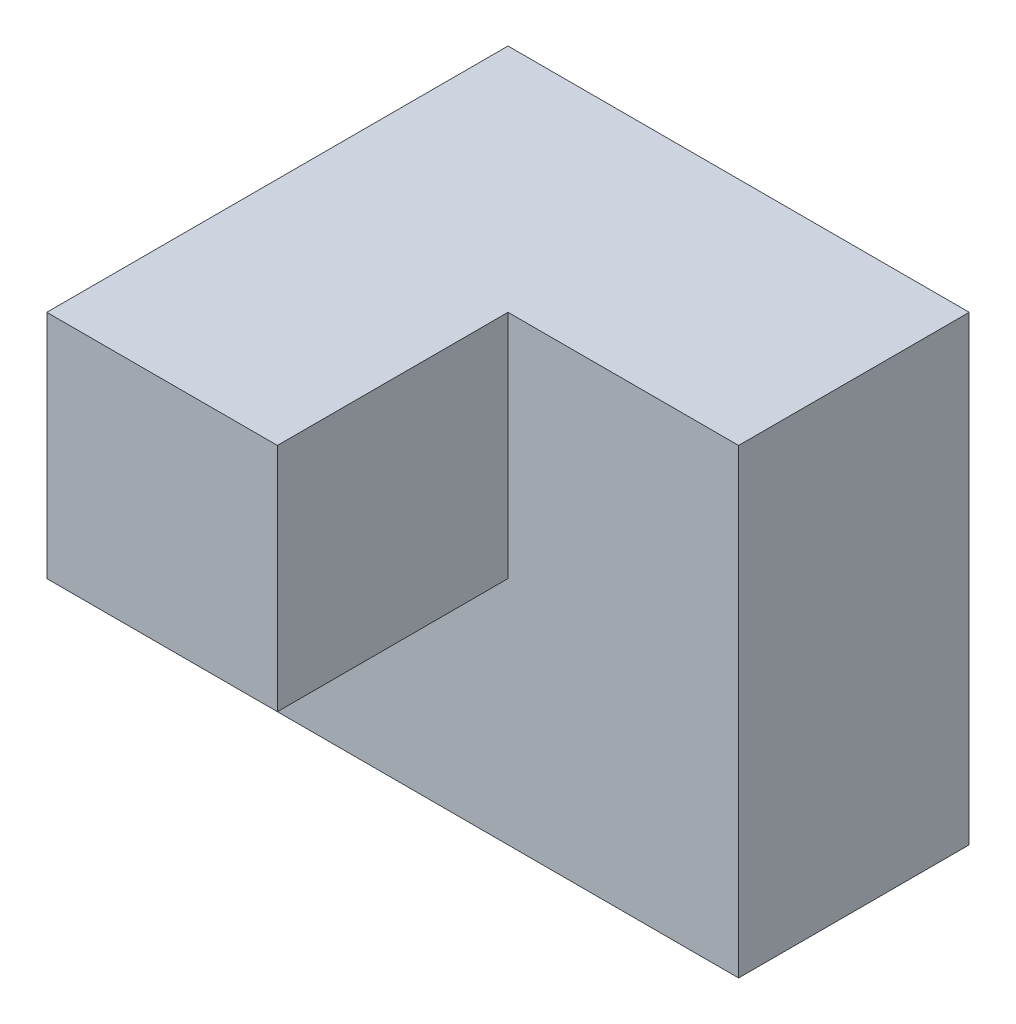
ISO-10303-21;
HEADER;
FILE_DESCRIPTION(('STEP AP214'),'2;1');
FILE_NAME('part.step','',(''),(''),'','','');
FILE_SCHEMA(('AUTOMOTIVE_DESIGN { 1 0 10303 214 1 1 1 1 }'));
ENDSEC;
DATA;
#1=APPLICATION_CONTEXT('core data for automotive mechanical design processes');
#2=APPLICATION_PROTOCOL_DEFINITION('international standard','automotive_design',2000,#1);
#3=PRODUCT_CONTEXT('',#1,'mechanical');
#4=PRODUCT('Part','Part','',(#3));
#5=PRODUCT_RELATED_PRODUCT_CATEGORY('part','',(#4));
#6=PRODUCT_DEFINITION_FORMATION('','',#4);
#7=PRODUCT_DEFINITION_CONTEXT('part definition',#1,'design');
#8=PRODUCT_DEFINITION('design','',#6,#7);
#9=PRODUCT_DEFINITION_SHAPE('','',#8);
#10=(LENGTH_UNIT() NAMED_UNIT(*) SI_UNIT(.MILLI.,.METRE.));
#11=(NAMED_UNIT(*) PLANE_ANGLE_UNIT() SI_UNIT($,.RADIAN.));
#12=(NAMED_UNIT(*) SI_UNIT($,.STERADIAN.) SOLID_ANGLE_UNIT());
#13=UNCERTAINTY_MEASURE_WITH_UNIT(LENGTH_MEASURE(1.E-05),#10,'distance_accuracy_value','');
#14=(GEOMETRIC_REPRESENTATION_CONTEXT(3) GLOBAL_UNCERTAINTY_ASSIGNED_CONTEXT((#13)) GLOBAL_UNIT_ASSIGNED_CONTEXT((#10,
#11,#12)) REPRESENTATION_CONTEXT('',''));
#15=CARTESIAN_POINT('',(0.,0.,0.));
#16=DIRECTION('',(0.,0.,1.));
#17=DIRECTION('',(1.,0.,0.));
#18=AXIS2_PLACEMENT_3D('',#15,#16,#17);
#19=CARTESIAN_POINT('',(0.,0.,19.05));
#20=DIRECTION('',(0.,0.,-1.));
#21=DIRECTION('',(-1.,0.,0.));
#22=AXIS2_PLACEMENT_3D('',#19,#20,#21);
#23=PLANE('',#22);
#24=DIRECTION('',(0.,1.,0.));
#25=VECTOR('',#24,1.);
#26=CARTESIAN_POINT('',(19.05,-19.05,19.05));
#27=LINE('',#26,#25);
#28=CARTESIAN_POINT('',(19.05,-19.05,19.05));
#29=VERTEX_POINT('',#28);
#30=CARTESIAN_POINT('',(19.05,0.,19.05));
#31=VERTEX_POINT('',#30);
#32=EDGE_CURVE('E125',#29,#31,#27,.T.);
#33=ORIENTED_EDGE('',*,*,#32,.F.);
#34=DIRECTION('',(1.,0.,0.));
#35=VECTOR('',#34,1.);
#36=CARTESIAN_POINT('',(0.,-19.05,19.05));
#37=LINE('',#36,#35);
#38=CARTESIAN_POINT('',(0.,-19.05,19.05));
#39=VERTEX_POINT('',#38);
#40=EDGE_CURVE('E66',#39,#29,#37,.T.);
#41=ORIENTED_EDGE('',*,*,#40,.F.);
#42=DIRECTION('',(0.,-1.,0.));
#43=VECTOR('',#42,1.);
#44=CARTESIAN_POINT('',(0.,-38.1,19.05));
#45=LINE('',#44,#43);
#46=CARTESIAN_POINT('',(0.,-38.1,19.05));
#47=VERTEX_POINT('',#46);
#48=EDGE_CURVE('E126',#39,#47,#45,.T.);
#49=ORIENTED_EDGE('',*,*,#48,.T.);
#50=DIRECTION('',(1.,0.,0.));
#51=VECTOR('',#50,1.);
#52=CARTESIAN_POINT('',(38.1,-38.1,19.05));
#53=LINE('',#52,#51);
#54=CARTESIAN_POINT('',(38.1,-38.1,19.05));
#55=VERTEX_POINT('',#54);
#56=EDGE_CURVE('E138',#47,#55,#53,.T.);
#57=ORIENTED_EDGE('',*,*,#56,.T.);
#58=DIRECTION('',(0.,1.,0.));
#59=VECTOR('',#58,1.);
#60=CARTESIAN_POINT('',(38.1,0.,19.05));
#61=LINE('',#60,#59);
#62=CARTESIAN_POINT('',(38.1,0.,19.05));
#63=VERTEX_POINT('',#62);
#64=EDGE_CURVE('E141',#55,#63,#61,.T.);
#65=ORIENTED_EDGE('',*,*,#64,.T.);
#66=DIRECTION('',(-1.,0.,0.));
#67=VECTOR('',#66,1.);
#68=CARTESIAN_POINT('',(0.,0.,19.05));
#69=LINE('',#68,#67);
#70=EDGE_CURVE('E65',#63,#31,#69,.T.);
#71=ORIENTED_EDGE('',*,*,#70,.T.);
#72=EDGE_LOOP('',(#33,#41,#49,#57,#65,#71));
#73=FACE_BOUND('',#72,.T.);
#74=ADVANCED_FACE('F50',(#73),#23,.F.);
#75=CARTESIAN_POINT('',(0.,-38.1,19.05));
#76=DIRECTION('',(1.,0.,0.));
#77=DIRECTION('',(0.,0.,-1.));
#78=AXIS2_PLACEMENT_3D('',#75,#76,#77);
#79=PLANE('',#78);
#80=DIRECTION('',(0.,-1.,0.));
#81=VECTOR('',#80,1.);
#82=CARTESIAN_POINT('',(0.,-38.1,0.));
#83=LINE('',#82,#81);
#84=CARTESIAN_POINT('',(0.,0.,0.));
#85=VERTEX_POINT('',#84);
#86=CARTESIAN_POINT('',(0.,-38.1,0.));
#87=VERTEX_POINT('',#86);
#88=EDGE_CURVE('E129',#85,#87,#83,.T.);
#89=ORIENTED_EDGE('',*,*,#88,.T.);
#90=DIRECTION('',(0.,0.,-1.));
#91=VECTOR('',#90,1.);
#92=CARTESIAN_POINT('',(0.,-38.1,19.05));
#93=LINE('',#92,#91);
#94=EDGE_CURVE('E11',#47,#87,#93,.T.);
#95=ORIENTED_EDGE('',*,*,#94,.F.);
#96=ORIENTED_EDGE('',*,*,#48,.F.);
#97=DIRECTION('',(0.,0.,-1.));
#98=VECTOR('',#97,1.);
#99=CARTESIAN_POINT('',(0.,-19.05,38.1));
#100=LINE('',#99,#98);
#101=CARTESIAN_POINT('',(0.,-19.05,38.1));
#102=VERTEX_POINT('',#101);
#103=EDGE_CURVE('E107',#102,#39,#100,.T.);
#104=ORIENTED_EDGE('',*,*,#103,.F.);
#105=DIRECTION('',(0.,-1.,0.));
#106=VECTOR('',#105,1.);
#107=CARTESIAN_POINT('',(0.,-19.05,38.1));
#108=LINE('',#107,#106);
#109=CARTESIAN_POINT('',(0.,0.,38.1));
#110=VERTEX_POINT('',#109);
#111=EDGE_CURVE('E113',#110,#102,#108,.T.);
#112=ORIENTED_EDGE('',*,*,#111,.F.);
#113=DIRECTION('',(0.,0.,-1.));
#114=VECTOR('',#113,1.);
#115=CARTESIAN_POINT('',(0.,0.,19.05));
#116=LINE('',#115,#114);
#117=EDGE_CURVE('E142',#110,#85,#116,.T.);
#118=ORIENTED_EDGE('',*,*,#117,.T.);
#119=EDGE_LOOP('',(#89,#95,#96,#104,#112,#118));
#120=FACE_BOUND('',#119,.T.);
#121=ADVANCED_FACE('F47',(#120),#79,.F.);
#122=CARTESIAN_POINT('',(38.1,-38.1,19.05));
#123=DIRECTION('',(0.,1.,0.));
#124=DIRECTION('',(0.,0.,1.));
#125=AXIS2_PLACEMENT_3D('',#122,#123,#124);
#126=PLANE('',#125);
#127=DIRECTION('',(1.,0.,0.));
#128=VECTOR('',#127,1.);
#129=CARTESIAN_POINT('',(38.1,-38.1,0.));
#130=LINE('',#129,#128);
#131=CARTESIAN_POINT('',(38.1,-38.1,0.));
#132=VERTEX_POINT('',#131);
#133=EDGE_CURVE('E131',#87,#132,#130,.T.);
#134=ORIENTED_EDGE('',*,*,#133,.T.);
#135=DIRECTION('',(0.,0.,-1.));
#136=VECTOR('',#135,1.);
#137=CARTESIAN_POINT('',(38.1,-38.1,19.05));
#138=LINE('',#137,#136);
#139=EDGE_CURVE('E54',#55,#132,#138,.T.);
#140=ORIENTED_EDGE('',*,*,#139,.F.);
#141=ORIENTED_EDGE('',*,*,#56,.F.);
#142=ORIENTED_EDGE('',*,*,#94,.T.);
#143=EDGE_LOOP('',(#134,#140,#141,#142));
#144=FACE_BOUND('',#143,.T.);
#145=ADVANCED_FACE('F167',(#144),#126,.F.);
#146=CARTESIAN_POINT('',(38.1,0.,19.05));
#147=DIRECTION('',(-1.,0.,0.));
#148=DIRECTION('',(0.,-1.,0.));
#149=AXIS2_PLACEMENT_3D('',#146,#147,#148);
#150=PLANE('',#149);
#151=DIRECTION('',(0.,1.,0.));
#152=VECTOR('',#151,1.);
#153=CARTESIAN_POINT('',(38.1,0.,0.));
#154=LINE('',#153,#152);
#155=CARTESIAN_POINT('',(38.1,0.,0.));
#156=VERTEX_POINT('',#155);
#157=EDGE_CURVE('E147',#132,#156,#154,.T.);
#158=ORIENTED_EDGE('',*,*,#157,.T.);
#159=DIRECTION('',(0.,0.,-1.));
#160=VECTOR('',#159,1.);
#161=CARTESIAN_POINT('',(38.1,0.,19.05));
#162=LINE('',#161,#160);
#163=EDGE_CURVE('E148',#63,#156,#162,.T.);
#164=ORIENTED_EDGE('',*,*,#163,.F.);
#165=ORIENTED_EDGE('',*,*,#64,.F.);
#166=ORIENTED_EDGE('',*,*,#139,.T.);
#167=EDGE_LOOP('',(#158,#164,#165,#166));
#168=FACE_BOUND('',#167,.T.);
#169=ADVANCED_FACE('F160',(#168),#150,.F.);
#170=CARTESIAN_POINT('',(0.,0.,19.05));
#171=DIRECTION('',(0.,-1.,0.));
#172=DIRECTION('',(0.,0.,-1.));
#173=AXIS2_PLACEMENT_3D('',#170,#171,#172);
#174=PLANE('',#173);
#175=DIRECTION('',(-1.,0.,0.));
#176=VECTOR('',#175,1.);
#177=CARTESIAN_POINT('',(0.,0.,0.));
#178=LINE('',#177,#176);
#179=EDGE_CURVE('E137',#156,#85,#178,.T.);
#180=ORIENTED_EDGE('',*,*,#179,.T.);
#181=ORIENTED_EDGE('',*,*,#117,.F.);
#182=DIRECTION('',(-1.,0.,0.));
#183=VECTOR('',#182,1.);
#184=CARTESIAN_POINT('',(0.,0.,38.1));
#185=LINE('',#184,#183);
#186=CARTESIAN_POINT('',(19.05,0.,38.1));
#187=VERTEX_POINT('',#186);
#188=EDGE_CURVE('E123',#187,#110,#185,.T.);
#189=ORIENTED_EDGE('',*,*,#188,.F.);
#190=DIRECTION('',(0.,0.,-1.));
#191=VECTOR('',#190,1.);
#192=CARTESIAN_POINT('',(19.05,0.,38.1));
#193=LINE('',#192,#191);
#194=EDGE_CURVE('E133',#187,#31,#193,.T.);
#195=ORIENTED_EDGE('',*,*,#194,.T.);
#196=ORIENTED_EDGE('',*,*,#70,.F.);
#197=ORIENTED_EDGE('',*,*,#163,.T.);
#198=EDGE_LOOP('',(#180,#181,#189,#195,#196,#197));
#199=FACE_BOUND('',#198,.T.);
#200=ADVANCED_FACE('F168',(#199),#174,.F.);
#201=CARTESIAN_POINT('',(0.,0.,0.));
#202=DIRECTION('',(0.,0.,-1.));
#203=DIRECTION('',(-1.,0.,0.));
#204=AXIS2_PLACEMENT_3D('',#201,#202,#203);
#205=PLANE('',#204);
#206=ORIENTED_EDGE('',*,*,#88,.F.);
#207=ORIENTED_EDGE('',*,*,#179,.F.);
#208=ORIENTED_EDGE('',*,*,#157,.F.);
#209=ORIENTED_EDGE('',*,*,#133,.F.);
#210=EDGE_LOOP('',(#206,#207,#208,#209));
#211=FACE_BOUND('',#210,.T.);
#212=ADVANCED_FACE('F162',(#211),#205,.T.);
#213=CARTESIAN_POINT('',(0.,-19.05,38.1));
#214=DIRECTION('',(0.,1.,0.));
#215=DIRECTION('',(0.,0.,1.));
#216=AXIS2_PLACEMENT_3D('',#213,#214,#215);
#217=PLANE('',#216);
#218=ORIENTED_EDGE('',*,*,#40,.T.);
#219=DIRECTION('',(0.,0.,-1.));
#220=VECTOR('',#219,1.);
#221=CARTESIAN_POINT('',(19.05,-19.05,38.1));
#222=LINE('',#221,#220);
#223=CARTESIAN_POINT('',(19.05,-19.05,38.1));
#224=VERTEX_POINT('',#223);
#225=EDGE_CURVE('E112',#224,#29,#222,.T.);
#226=ORIENTED_EDGE('',*,*,#225,.F.);
#227=DIRECTION('',(1.,0.,0.));
#228=VECTOR('',#227,1.);
#229=CARTESIAN_POINT('',(0.,-19.05,38.1));
#230=LINE('',#229,#228);
#231=EDGE_CURVE('E103',#102,#224,#230,.T.);
#232=ORIENTED_EDGE('',*,*,#231,.F.);
#233=ORIENTED_EDGE('',*,*,#103,.T.);
#234=EDGE_LOOP('',(#218,#226,#232,#233));
#235=FACE_BOUND('',#234,.T.);
#236=ADVANCED_FACE('F110',(#235),#217,.F.);
#237=CARTESIAN_POINT('',(19.05,-19.05,38.1));
#238=DIRECTION('',(-1.,0.,0.));
#239=DIRECTION('',(0.,0.,1.));
#240=AXIS2_PLACEMENT_3D('',#237,#238,#239);
#241=PLANE('',#240);
#242=ORIENTED_EDGE('',*,*,#32,.T.);
#243=ORIENTED_EDGE('',*,*,#194,.F.);
#244=DIRECTION('',(0.,1.,0.));
#245=VECTOR('',#244,1.);
#246=CARTESIAN_POINT('',(19.05,-19.05,38.1));
#247=LINE('',#246,#245);
#248=EDGE_CURVE('E114',#224,#187,#247,.T.);
#249=ORIENTED_EDGE('',*,*,#248,.F.);
#250=ORIENTED_EDGE('',*,*,#225,.T.);
#251=EDGE_LOOP('',(#242,#243,#249,#250));
#252=FACE_BOUND('',#251,.T.);
#253=ADVANCED_FACE('F172',(#252),#241,.F.);
#254=CARTESIAN_POINT('',(0.,0.,38.1));
#255=DIRECTION('',(0.,0.,-1.));
#256=DIRECTION('',(-1.,0.,0.));
#257=AXIS2_PLACEMENT_3D('',#254,#255,#256);
#258=PLANE('',#257);
#259=ORIENTED_EDGE('',*,*,#111,.T.);
#260=ORIENTED_EDGE('',*,*,#231,.T.);
#261=ORIENTED_EDGE('',*,*,#248,.T.);
#262=ORIENTED_EDGE('',*,*,#188,.T.);
#263=EDGE_LOOP('',(#259,#260,#261,#262));
#264=FACE_BOUND('',#263,.T.);
#265=ADVANCED_FACE('F117',(#264),#258,.F.);
#266=CLOSED_SHELL('',(#74,#121,#145,#169,#200,#212,#236,#253,#265));
#267=MANIFOLD_SOLID_BREP('B2',#266);
#268=ADVANCED_BREP_SHAPE_REPRESENTATION('',(#18,#267),#14);
#269=SHAPE_DEFINITION_REPRESENTATION(#9,#268);
ENDSEC;
END-ISO-10303-21;
